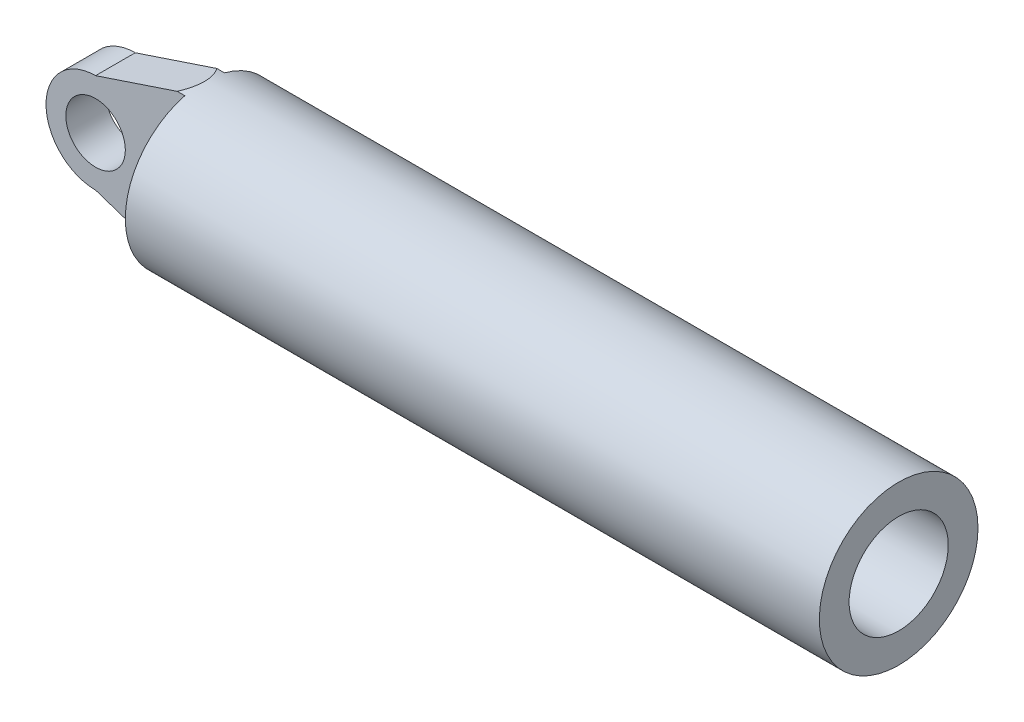
ISO-10303-21;
HEADER;
FILE_DESCRIPTION(('STEP AP214'),'2;1');
FILE_NAME('part.step','',(''),(''),'','','');
FILE_SCHEMA(('AUTOMOTIVE_DESIGN { 1 0 10303 214 1 1 1 1 }'));
ENDSEC;
DATA;
#1=APPLICATION_CONTEXT('core data for automotive mechanical design processes');
#2=APPLICATION_PROTOCOL_DEFINITION('international standard','automotive_design',2000,#1);
#3=PRODUCT_CONTEXT('',#1,'mechanical');
#4=PRODUCT('Part','Part','',(#3));
#5=PRODUCT_RELATED_PRODUCT_CATEGORY('part','',(#4));
#6=PRODUCT_DEFINITION_FORMATION('','',#4);
#7=PRODUCT_DEFINITION_CONTEXT('part definition',#1,'design');
#8=PRODUCT_DEFINITION('design','',#6,#7);
#9=PRODUCT_DEFINITION_SHAPE('','',#8);
#10=(LENGTH_UNIT() NAMED_UNIT(*) SI_UNIT(.MILLI.,.METRE.));
#11=(NAMED_UNIT(*) PLANE_ANGLE_UNIT() SI_UNIT($,.RADIAN.));
#12=(NAMED_UNIT(*) SI_UNIT($,.STERADIAN.) SOLID_ANGLE_UNIT());
#13=UNCERTAINTY_MEASURE_WITH_UNIT(LENGTH_MEASURE(1.E-05),#10,'distance_accuracy_value','');
#14=(GEOMETRIC_REPRESENTATION_CONTEXT(3) GLOBAL_UNCERTAINTY_ASSIGNED_CONTEXT((#13)) GLOBAL_UNIT_ASSIGNED_CONTEXT((#10,
#11,#12)) REPRESENTATION_CONTEXT('',''));
#15=CARTESIAN_POINT('',(0.,0.,0.));
#16=DIRECTION('',(0.,0.,1.));
#17=DIRECTION('',(1.,0.,0.));
#18=AXIS2_PLACEMENT_3D('',#15,#16,#17);
#19=CARTESIAN_POINT('',(-45.,-25.,-10.));
#20=DIRECTION('',(-0.316227766016838,-0.948683298050514,0.));
#21=DIRECTION('',(0.948683298050514,-0.316227766016838,0.));
#22=AXIS2_PLACEMENT_3D('',#19,#20,#21);
#23=PLANE('',#22);
#24=CARTESIAN_POINT('',(-120.,0.,0.));
#25=DIRECTION('',(-0.316227766016838,-0.948683298050514,0.));
#26=DIRECTION('',(0.948683298050514,-0.316227766016838,0.));
#27=AXIS2_PLACEMENT_3D('',#24,#25,#26);
#28=ELLIPSE('',#27,126.491106406735,40.);
#29=CARTESIAN_POINT('',(-3.81049961377751,-38.7298334620742,-10.));
#30=VERTEX_POINT('',#29);
#31=CARTESIAN_POINT('',(-3.8104996137775,-38.7298334620742,10.));
#32=VERTEX_POINT('',#31);
#33=EDGE_CURVE('E95',#30,#32,#28,.T.);
#34=ORIENTED_EDGE('',*,*,#33,.T.);
#35=DIRECTION('',(0.948683298050514,-0.316227766016838,0.));
#36=VECTOR('',#35,1.);
#37=CARTESIAN_POINT('',(-45.,-25.,10.));
#38=LINE('',#37,#36);
#39=CARTESIAN_POINT('',(-45.,-25.,10.));
#40=VERTEX_POINT('',#39);
#41=EDGE_CURVE('E124',#40,#32,#38,.T.);
#42=ORIENTED_EDGE('',*,*,#41,.F.);
#43=DIRECTION('',(0.,0.,1.));
#44=VECTOR('',#43,1.);
#45=CARTESIAN_POINT('',(-45.,-25.,-10.));
#46=LINE('',#45,#44);
#47=CARTESIAN_POINT('',(-45.,-25.,-10.));
#48=VERTEX_POINT('',#47);
#49=EDGE_CURVE('E137',#48,#40,#46,.T.);
#50=ORIENTED_EDGE('',*,*,#49,.F.);
#51=DIRECTION('',(0.948683298050514,-0.316227766016838,0.));
#52=VECTOR('',#51,1.);
#53=CARTESIAN_POINT('',(-45.,-25.,-10.));
#54=LINE('',#53,#52);
#55=EDGE_CURVE('E133',#48,#30,#54,.T.);
#56=ORIENTED_EDGE('',*,*,#55,.T.);
#57=EDGE_LOOP('',(#34,#42,#50,#56));
#58=FACE_BOUND('',#57,.T.);
#59=ADVANCED_FACE('F33',(#58),#23,.T.);
#60=CARTESIAN_POINT('',(0.,40.,-10.));
#61=DIRECTION('',(-0.316227766016838,0.948683298050514,0.));
#62=DIRECTION('',(-0.948683298050514,-0.316227766016838,0.));
#63=AXIS2_PLACEMENT_3D('',#60,#61,#62);
#64=PLANE('',#63);
#65=DIRECTION('',(-0.948683298050514,-0.316227766016838,0.));
#66=VECTOR('',#65,1.);
#67=CARTESIAN_POINT('',(0.,40.,10.));
#68=LINE('',#67,#66);
#69=CARTESIAN_POINT('',(-3.81049961377749,38.7298334620742,10.));
#70=VERTEX_POINT('',#69);
#71=CARTESIAN_POINT('',(-45.,25.,10.));
#72=VERTEX_POINT('',#71);
#73=EDGE_CURVE('E119',#70,#72,#68,.T.);
#74=ORIENTED_EDGE('',*,*,#73,.F.);
#75=CARTESIAN_POINT('',(-120.,0.,0.));
#76=DIRECTION('',(-0.316227766016838,0.948683298050514,0.));
#77=DIRECTION('',(0.948683298050514,0.316227766016838,0.));
#78=AXIS2_PLACEMENT_3D('',#75,#76,#77);
#79=ELLIPSE('',#78,126.491106406735,40.);
#80=CARTESIAN_POINT('',(-3.81049961377749,38.7298334620742,-10.));
#81=VERTEX_POINT('',#80);
#82=EDGE_CURVE('E48',#70,#81,#79,.T.);
#83=ORIENTED_EDGE('',*,*,#82,.T.);
#84=DIRECTION('',(-0.948683298050514,-0.316227766016838,0.));
#85=VECTOR('',#84,1.);
#86=CARTESIAN_POINT('',(0.,40.,-10.));
#87=LINE('',#86,#85);
#88=CARTESIAN_POINT('',(-45.,25.,-10.));
#89=VERTEX_POINT('',#88);
#90=EDGE_CURVE('E93',#81,#89,#87,.T.);
#91=ORIENTED_EDGE('',*,*,#90,.T.);
#92=DIRECTION('',(0.,0.,1.));
#93=VECTOR('',#92,1.);
#94=CARTESIAN_POINT('',(-45.,25.,-10.));
#95=LINE('',#94,#93);
#96=EDGE_CURVE('E136',#89,#72,#95,.T.);
#97=ORIENTED_EDGE('',*,*,#96,.T.);
#98=EDGE_LOOP('',(#74,#83,#91,#97));
#99=FACE_BOUND('',#98,.T.);
#100=ADVANCED_FACE('F160',(#99),#64,.T.);
#101=CARTESIAN_POINT('',(-45.,0.,-10.));
#102=DIRECTION('',(0.,0.,1.));
#103=DIRECTION('',(1.,0.,0.));
#104=AXIS2_PLACEMENT_3D('',#101,#102,#103);
#105=PLANE('',#104);
#106=CARTESIAN_POINT('',(-45.,0.,-10.));
#107=DIRECTION('',(0.,0.,1.));
#108=DIRECTION('',(1.,0.,0.));
#109=AXIS2_PLACEMENT_3D('',#106,#107,#108);
#110=CIRCLE('',#109,15.);
#111=CARTESIAN_POINT('',(-30.,0.,-10.));
#112=VERTEX_POINT('',#111);
#113=EDGE_CURVE('E126',#112,#112,#110,.T.);
#114=ORIENTED_EDGE('',*,*,#113,.T.);
#115=EDGE_LOOP('',(#114));
#116=FACE_BOUND('',#115,.T.);
#117=DIRECTION('',(1.,0.,0.));
#118=VECTOR('',#117,1.);
#119=CARTESIAN_POINT('',(-68.,-38.7298334620742,-10.));
#120=LINE('',#119,#118);
#121=CARTESIAN_POINT('',(0.,-38.7298334620742,-10.));
#122=VERTEX_POINT('',#121);
#123=EDGE_CURVE('E103',#30,#122,#120,.T.);
#124=ORIENTED_EDGE('',*,*,#123,.F.);
#125=ORIENTED_EDGE('',*,*,#55,.F.);
#126=CARTESIAN_POINT('',(-45.,0.,-10.));
#127=DIRECTION('',(0.,0.,1.));
#128=DIRECTION('',(1.,0.,0.));
#129=AXIS2_PLACEMENT_3D('',#126,#127,#128);
#130=CIRCLE('',#129,25.);
#131=EDGE_CURVE('E130',#89,#48,#130,.T.);
#132=ORIENTED_EDGE('',*,*,#131,.F.);
#133=ORIENTED_EDGE('',*,*,#90,.F.);
#134=DIRECTION('',(1.,0.,0.));
#135=VECTOR('',#134,1.);
#136=CARTESIAN_POINT('',(-68.,38.7298334620742,-10.));
#137=LINE('',#136,#135);
#138=CARTESIAN_POINT('',(0.,38.7298334620742,-10.));
#139=VERTEX_POINT('',#138);
#140=EDGE_CURVE('E86',#139,#81,#137,.F.);
#141=ORIENTED_EDGE('',*,*,#140,.F.);
#142=DIRECTION('',(0.,1.,0.));
#143=VECTOR('',#142,1.);
#144=CARTESIAN_POINT('',(0.,40.,-10.));
#145=LINE('',#144,#143);
#146=EDGE_CURVE('E90',#122,#139,#145,.T.);
#147=ORIENTED_EDGE('',*,*,#146,.F.);
#148=EDGE_LOOP('',(#124,#125,#132,#133,#141,#147));
#149=FACE_BOUND('',#148,.T.);
#150=ADVANCED_FACE('F89',(#116,#149),#105,.F.);
#151=CARTESIAN_POINT('',(-45.,0.,10.));
#152=DIRECTION('',(0.,0.,1.));
#153=DIRECTION('',(1.,0.,0.));
#154=AXIS2_PLACEMENT_3D('',#151,#152,#153);
#155=PLANE('',#154);
#156=CARTESIAN_POINT('',(-45.,0.,10.));
#157=DIRECTION('',(0.,0.,1.));
#158=DIRECTION('',(1.,0.,0.));
#159=AXIS2_PLACEMENT_3D('',#156,#157,#158);
#160=CIRCLE('',#159,15.);
#161=CARTESIAN_POINT('',(-30.,0.,10.));
#162=VERTEX_POINT('',#161);
#163=EDGE_CURVE('E117',#162,#162,#160,.T.);
#164=ORIENTED_EDGE('',*,*,#163,.F.);
#165=EDGE_LOOP('',(#164));
#166=FACE_BOUND('',#165,.T.);
#167=ORIENTED_EDGE('',*,*,#41,.T.);
#168=DIRECTION('',(1.,0.,0.));
#169=VECTOR('',#168,1.);
#170=CARTESIAN_POINT('',(-68.,-38.7298334620742,10.));
#171=LINE('',#170,#169);
#172=CARTESIAN_POINT('',(0.,-38.7298334620742,10.));
#173=VERTEX_POINT('',#172);
#174=EDGE_CURVE('E11',#32,#173,#171,.T.);
#175=ORIENTED_EDGE('',*,*,#174,.T.);
#176=DIRECTION('',(0.,1.,0.));
#177=VECTOR('',#176,1.);
#178=CARTESIAN_POINT('',(0.,40.,10.));
#179=LINE('',#178,#177);
#180=CARTESIAN_POINT('',(0.,38.7298334620742,10.));
#181=VERTEX_POINT('',#180);
#182=EDGE_CURVE('E100',#173,#181,#179,.T.);
#183=ORIENTED_EDGE('',*,*,#182,.T.);
#184=DIRECTION('',(1.,0.,0.));
#185=VECTOR('',#184,1.);
#186=CARTESIAN_POINT('',(-68.,38.7298334620742,10.));
#187=LINE('',#186,#185);
#188=EDGE_CURVE('E41',#181,#70,#187,.F.);
#189=ORIENTED_EDGE('',*,*,#188,.T.);
#190=ORIENTED_EDGE('',*,*,#73,.T.);
#191=CARTESIAN_POINT('',(-45.,0.,10.));
#192=DIRECTION('',(0.,0.,1.));
#193=DIRECTION('',(1.,0.,0.));
#194=AXIS2_PLACEMENT_3D('',#191,#192,#193);
#195=CIRCLE('',#194,25.);
#196=EDGE_CURVE('E121',#72,#40,#195,.T.);
#197=ORIENTED_EDGE('',*,*,#196,.T.);
#198=EDGE_LOOP('',(#167,#175,#183,#189,#190,#197));
#199=FACE_BOUND('',#198,.T.);
#200=ADVANCED_FACE('F181',(#166,#199),#155,.T.);
#201=CARTESIAN_POINT('',(0.,0.,0.));
#202=DIRECTION('',(1.,0.,0.));
#203=DIRECTION('',(0.,0.,-1.));
#204=AXIS2_PLACEMENT_3D('',#201,#202,#203);
#205=PLANE('',#204);
#206=ORIENTED_EDGE('',*,*,#182,.F.);
#207=CARTESIAN_POINT('',(0.,0.,0.));
#208=DIRECTION('',(1.,0.,0.));
#209=DIRECTION('',(0.,0.,-1.));
#210=AXIS2_PLACEMENT_3D('',#207,#208,#209);
#211=CIRCLE('',#210,40.);
#212=EDGE_CURVE('E104',#181,#173,#211,.T.);
#213=ORIENTED_EDGE('',*,*,#212,.F.);
#214=EDGE_LOOP('',(#206,#213));
#215=FACE_BOUND('',#214,.T.);
#216=ADVANCED_FACE('F157',(#215),#205,.F.);
#217=CARTESIAN_POINT('',(350.,0.,0.));
#218=DIRECTION('',(-1.,0.,0.));
#219=DIRECTION('',(0.,0.,1.));
#220=AXIS2_PLACEMENT_3D('',#217,#218,#219);
#221=CYLINDRICAL_SURFACE('',#220,40.);
#222=CARTESIAN_POINT('',(350.,0.,0.));
#223=DIRECTION('',(1.,0.,0.));
#224=DIRECTION('',(0.,0.,-1.));
#225=AXIS2_PLACEMENT_3D('',#222,#223,#224);
#226=CIRCLE('',#225,40.);
#227=CARTESIAN_POINT('',(350.,0.,-40.));
#228=VERTEX_POINT('',#227);
#229=EDGE_CURVE('E101',#228,#228,#226,.T.);
#230=ORIENTED_EDGE('',*,*,#229,.F.);
#231=EDGE_LOOP('',(#230));
#232=FACE_BOUND('',#231,.T.);
#233=EDGE_CURVE('E99',#122,#139,#211,.T.);
#234=ORIENTED_EDGE('',*,*,#233,.T.);
#235=ORIENTED_EDGE('',*,*,#140,.T.);
#236=ORIENTED_EDGE('',*,*,#82,.F.);
#237=ORIENTED_EDGE('',*,*,#188,.F.);
#238=ORIENTED_EDGE('',*,*,#212,.T.);
#239=ORIENTED_EDGE('',*,*,#174,.F.);
#240=ORIENTED_EDGE('',*,*,#33,.F.);
#241=ORIENTED_EDGE('',*,*,#123,.T.);
#242=EDGE_LOOP('',(#234,#235,#236,#237,#238,#239,#240,#241));
#243=FACE_BOUND('',#242,.T.);
#244=ADVANCED_FACE('F35',(#232,#243),#221,.T.);
#245=CARTESIAN_POINT('',(350.,0.,0.));
#246=DIRECTION('',(1.,0.,0.));
#247=DIRECTION('',(0.,0.,-1.));
#248=AXIS2_PLACEMENT_3D('',#245,#246,#247);
#249=PLANE('',#248);
#250=CARTESIAN_POINT('',(350.,0.,0.));
#251=DIRECTION('',(1.,0.,0.));
#252=DIRECTION('',(0.,0.,-1.));
#253=AXIS2_PLACEMENT_3D('',#250,#251,#252);
#254=CIRCLE('',#253,25.);
#255=CARTESIAN_POINT('',(350.,0.,-25.));
#256=VERTEX_POINT('',#255);
#257=EDGE_CURVE('E105',#256,#256,#254,.T.);
#258=ORIENTED_EDGE('',*,*,#257,.F.);
#259=EDGE_LOOP('',(#258));
#260=FACE_BOUND('',#259,.T.);
#261=ORIENTED_EDGE('',*,*,#229,.T.);
#262=EDGE_LOOP('',(#261));
#263=FACE_BOUND('',#262,.T.);
#264=ADVANCED_FACE('F156',(#260,#263),#249,.T.);
#265=ORIENTED_EDGE('',*,*,#233,.F.);
#266=ORIENTED_EDGE('',*,*,#146,.T.);
#267=EDGE_LOOP('',(#265,#266));
#268=FACE_BOUND('',#267,.T.);
#269=ADVANCED_FACE('F98',(#268),#205,.F.);
#270=CARTESIAN_POINT('',(350.,0.,0.));
#271=DIRECTION('',(-1.,0.,0.));
#272=DIRECTION('',(0.,0.,1.));
#273=AXIS2_PLACEMENT_3D('',#270,#271,#272);
#274=CYLINDRICAL_SURFACE('',#273,25.);
#275=ORIENTED_EDGE('',*,*,#257,.T.);
#276=EDGE_LOOP('',(#275));
#277=FACE_BOUND('',#276,.T.);
#278=CARTESIAN_POINT('',(15.,0.,0.));
#279=DIRECTION('',(1.,0.,0.));
#280=DIRECTION('',(0.,0.,-1.));
#281=AXIS2_PLACEMENT_3D('',#278,#279,#280);
#282=CIRCLE('',#281,25.);
#283=CARTESIAN_POINT('',(15.,0.,-25.));
#284=VERTEX_POINT('',#283);
#285=EDGE_CURVE('E109',#284,#284,#282,.T.);
#286=ORIENTED_EDGE('',*,*,#285,.F.);
#287=EDGE_LOOP('',(#286));
#288=FACE_BOUND('',#287,.T.);
#289=ADVANCED_FACE('F146',(#277,#288),#274,.F.);
#290=CARTESIAN_POINT('',(15.,0.,0.));
#291=DIRECTION('',(1.,0.,0.));
#292=DIRECTION('',(0.,0.,-1.));
#293=AXIS2_PLACEMENT_3D('',#290,#291,#292);
#294=PLANE('',#293);
#295=ORIENTED_EDGE('',*,*,#285,.T.);
#296=EDGE_LOOP('',(#295));
#297=FACE_BOUND('',#296,.T.);
#298=ADVANCED_FACE('F144',(#297),#294,.T.);
#299=CARTESIAN_POINT('',(-45.,0.,-10.));
#300=DIRECTION('',(0.,0.,1.));
#301=DIRECTION('',(1.,0.,0.));
#302=AXIS2_PLACEMENT_3D('',#299,#300,#301);
#303=CYLINDRICAL_SURFACE('',#302,25.);
#304=ORIENTED_EDGE('',*,*,#49,.T.);
#305=ORIENTED_EDGE('',*,*,#196,.F.);
#306=ORIENTED_EDGE('',*,*,#96,.F.);
#307=ORIENTED_EDGE('',*,*,#131,.T.);
#308=EDGE_LOOP('',(#304,#305,#306,#307));
#309=FACE_BOUND('',#308,.T.);
#310=ADVANCED_FACE('F154',(#309),#303,.T.);
#311=CARTESIAN_POINT('',(-45.,0.,-10.));
#312=DIRECTION('',(0.,0.,1.));
#313=DIRECTION('',(1.,0.,0.));
#314=AXIS2_PLACEMENT_3D('',#311,#312,#313);
#315=CYLINDRICAL_SURFACE('',#314,15.);
#316=ORIENTED_EDGE('',*,*,#113,.F.);
#317=EDGE_LOOP('',(#316));
#318=FACE_BOUND('',#317,.T.);
#319=ORIENTED_EDGE('',*,*,#163,.T.);
#320=EDGE_LOOP('',(#319));
#321=FACE_BOUND('',#320,.T.);
#322=ADVANCED_FACE('F171',(#318,#321),#315,.F.);
#323=CLOSED_SHELL('',(#59,#100,#150,#200,#216,#244,#264,#269,#289,#298,#310,#322));
#324=MANIFOLD_SOLID_BREP('B2',#323);
#325=ADVANCED_BREP_SHAPE_REPRESENTATION('',(#18,#324),#14);
#326=SHAPE_DEFINITION_REPRESENTATION(#9,#325);
ENDSEC;
END-ISO-10303-21;
